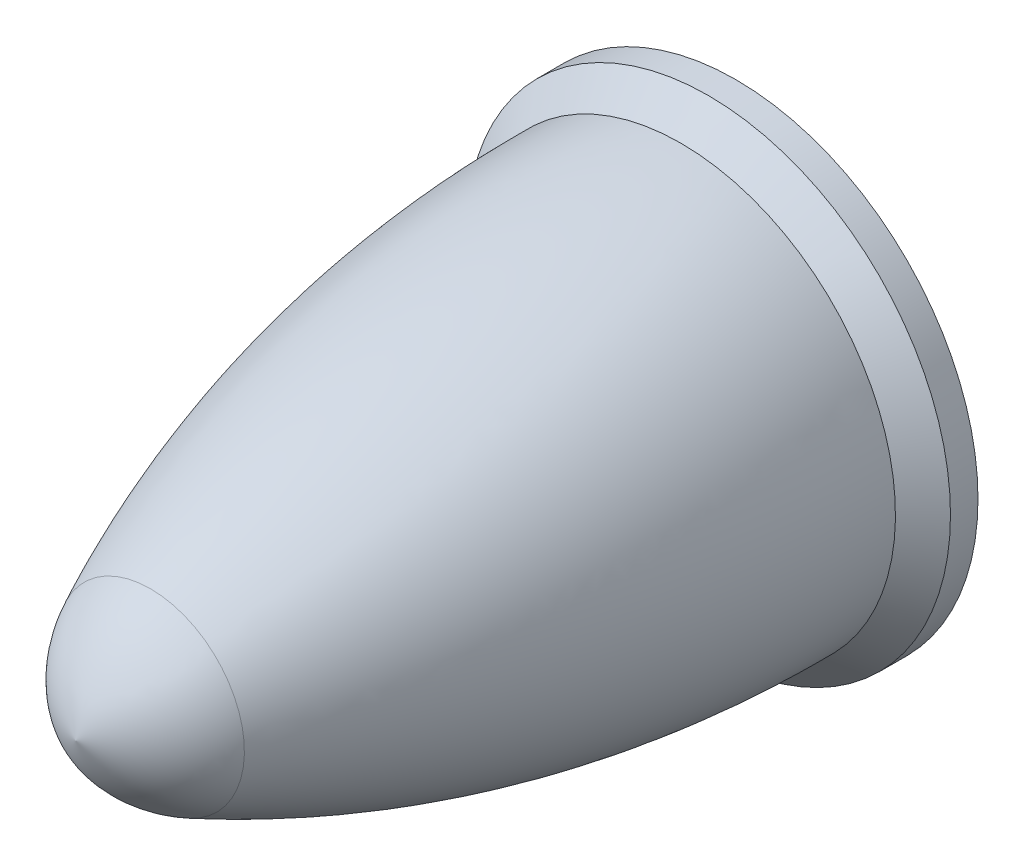
ISO-10303-21;
HEADER;
FILE_DESCRIPTION(('STEP AP214'),'2;1');
FILE_NAME('part.step','',(''),(''),'','','');
FILE_SCHEMA(('AUTOMOTIVE_DESIGN { 1 0 10303 214 1 1 1 1 }'));
ENDSEC;
DATA;
#1=APPLICATION_CONTEXT('core data for automotive mechanical design processes');
#2=APPLICATION_PROTOCOL_DEFINITION('international standard','automotive_design',2000,#1);
#3=PRODUCT_CONTEXT('',#1,'mechanical');
#4=PRODUCT('Part','Part','',(#3));
#5=PRODUCT_RELATED_PRODUCT_CATEGORY('part','',(#4));
#6=PRODUCT_DEFINITION_FORMATION('','',#4);
#7=PRODUCT_DEFINITION_CONTEXT('part definition',#1,'design');
#8=PRODUCT_DEFINITION('design','',#6,#7);
#9=PRODUCT_DEFINITION_SHAPE('','',#8);
#10=(LENGTH_UNIT() NAMED_UNIT(*) SI_UNIT(.MILLI.,.METRE.));
#11=(NAMED_UNIT(*) PLANE_ANGLE_UNIT() SI_UNIT($,.RADIAN.));
#12=(NAMED_UNIT(*) SI_UNIT($,.STERADIAN.) SOLID_ANGLE_UNIT());
#13=UNCERTAINTY_MEASURE_WITH_UNIT(LENGTH_MEASURE(1.E-05),#10,'distance_accuracy_value','');
#14=(GEOMETRIC_REPRESENTATION_CONTEXT(3) GLOBAL_UNCERTAINTY_ASSIGNED_CONTEXT((#13)) GLOBAL_UNIT_ASSIGNED_CONTEXT((#10,
#11,#12)) REPRESENTATION_CONTEXT('',''));
#15=CARTESIAN_POINT('',(0.,0.,0.));
#16=DIRECTION('',(0.,0.,1.));
#17=DIRECTION('',(1.,0.,0.));
#18=AXIS2_PLACEMENT_3D('',#15,#16,#17);
#19=CARTESIAN_POINT('',(0.,-3.,21.9999999999914));
#20=DIRECTION('',(0.,0.,-1.));
#21=DIRECTION('',(-1.,0.,0.));
#22=AXIS2_PLACEMENT_3D('',#19,#20,#21);
#23=CONICAL_SURFACE('',#22,2.50000000001182,1.02974425866684);
#24=CARTESIAN_POINT('',(0.,-2.99999999994316,23.5021515475466));
#25=VERTEX_POINT('',#24);
#26=VERTEX_LOOP('',#25);
#27=FACE_BOUND('',#26,.T.);
#28=CARTESIAN_POINT('',(0.,-3.,22.));
#29=DIRECTION('',(0.,0.,-1.));
#30=DIRECTION('',(0.,1.,0.));
#31=AXIS2_PLACEMENT_3D('',#28,#29,#30);
#32=CIRCLE('',#31,2.49999999999999);
#33=CARTESIAN_POINT('',(0.,-0.500000000000013,22.));
#34=VERTEX_POINT('',#33);
#35=EDGE_CURVE('E36',#34,#34,#32,.T.);
#36=ORIENTED_EDGE('',*,*,#35,.T.);
#37=EDGE_LOOP('',(#36));
#38=FACE_BOUND('',#37,.T.);
#39=ADVANCED_FACE('F16',(#27,#38),#23,.F.);
#40=CARTESIAN_POINT('',(0.,-3.,0.));
#41=DIRECTION('',(0.,0.,-1.));
#42=DIRECTION('',(0.,1.,0.));
#43=AXIS2_PLACEMENT_3D('',#40,#41,#42);
#44=CYLINDRICAL_SURFACE('',#43,2.49999999999999);
#45=CARTESIAN_POINT('',(0.,-3.,0.));
#46=DIRECTION('',(0.,0.,-1.));
#47=DIRECTION('',(0.,1.,0.));
#48=AXIS2_PLACEMENT_3D('',#45,#46,#47);
#49=CIRCLE('',#48,2.49999999999999);
#50=CARTESIAN_POINT('',(0.,-0.500000000000011,0.));
#51=VERTEX_POINT('',#50);
#52=EDGE_CURVE('E19',#51,#51,#49,.F.);
#53=ORIENTED_EDGE('',*,*,#52,.F.);
#54=EDGE_LOOP('',(#53));
#55=FACE_BOUND('',#54,.T.);
#56=ORIENTED_EDGE('',*,*,#35,.F.);
#57=EDGE_LOOP('',(#56));
#58=FACE_BOUND('',#57,.T.);
#59=ADVANCED_FACE('F33',(#55,#58),#44,.F.);
#60=CARTESIAN_POINT('',(0.,-3.,0.));
#61=DIRECTION('',(0.,0.,-1.));
#62=DIRECTION('',(0.,1.,0.));
#63=AXIS2_PLACEMENT_3D('',#60,#61,#62);
#64=PLANE('',#63);
#65=CARTESIAN_POINT('',(0.,-3.,0.));
#66=DIRECTION('',(0.,0.,-1.));
#67=DIRECTION('',(0.,1.,0.));
#68=AXIS2_PLACEMENT_3D('',#65,#66,#67);
#69=CIRCLE('',#68,8.80000000069722);
#70=CARTESIAN_POINT('',(0.,5.80000000069722,0.));
#71=VERTEX_POINT('',#70);
#72=EDGE_CURVE('E40',#71,#71,#69,.F.);
#73=ORIENTED_EDGE('',*,*,#72,.F.);
#74=EDGE_LOOP('',(#73));
#75=FACE_BOUND('',#74,.T.);
#76=ORIENTED_EDGE('',*,*,#52,.T.);
#77=EDGE_LOOP('',(#76));
#78=FACE_BOUND('',#77,.T.);
#79=ADVANCED_FACE('F66',(#75,#78),#64,.T.);
#80=CARTESIAN_POINT('',(0.,-3.,0.));
#81=DIRECTION('',(0.,0.,-1.));
#82=DIRECTION('',(0.,1.,0.));
#83=AXIS2_PLACEMENT_3D('',#80,#81,#82);
#84=CYLINDRICAL_SURFACE('',#83,8.80000000069722);
#85=ORIENTED_EDGE('',*,*,#72,.T.);
#86=EDGE_LOOP('',(#85));
#87=FACE_BOUND('',#86,.T.);
#88=CARTESIAN_POINT('',(0.,-3.,1.00000000015868));
#89=DIRECTION('',(0.,0.,-1.));
#90=DIRECTION('',(0.,1.,0.));
#91=AXIS2_PLACEMENT_3D('',#88,#89,#90);
#92=CIRCLE('',#91,8.80000000069722);
#93=CARTESIAN_POINT('',(0.,5.80000000069722,1.00000000015868));
#94=VERTEX_POINT('',#93);
#95=EDGE_CURVE('E42',#94,#94,#92,.F.);
#96=ORIENTED_EDGE('',*,*,#95,.F.);
#97=EDGE_LOOP('',(#96));
#98=FACE_BOUND('',#97,.T.);
#99=ADVANCED_FACE('F62',(#87,#98),#84,.T.);
#100=CARTESIAN_POINT('',(0.,-4.1790602896945,19.0224405675289));
#101=DIRECTION('',(1.,0.,0.));
#102=DIRECTION('',(0.,1.,0.));
#103=AXIS2_PLACEMENT_3D('',#100,#101,#102);
#104=CIRCLE('',#103,5.11529872739771);
#105=TRIMMED_CURVE('',#104,(PARAMETER_VALUE(-1.33820806663948)),
(PARAMETER_VALUE(1.33820806663948)),.T.,.PARAMETER.);
#106=CARTESIAN_POINT('',(0.,-3.,19.0224405675289));
#107=DIRECTION('',(0.,0.,-1.));
#108=AXIS1_PLACEMENT('',#106,#107);
#109=SURFACE_OF_REVOLUTION('',#105,#108);
#110=CARTESIAN_POINT('',(0.,-3.,24.));
#111=VERTEX_POINT('',#110);
#112=VERTEX_LOOP('',#111);
#113=FACE_BOUND('',#112,.T.);
#114=CARTESIAN_POINT('',(0.,-3.,21.2767175898783));
#115=DIRECTION('',(0.,0.,-1.));
#116=DIRECTION('',(0.,1.,0.));
#117=AXIS2_PLACEMENT_3D('',#114,#115,#116);
#118=CIRCLE('',#117,3.41272761666876);
#119=CARTESIAN_POINT('',(0.,0.412727616668766,21.2767175898783));
#120=VERTEX_POINT('',#119);
#121=EDGE_CURVE('E25',#120,#120,#118,.T.);
#122=ORIENTED_EDGE('',*,*,#121,.F.);
#123=EDGE_LOOP('',(#122));
#124=FACE_BOUND('',#123,.T.);
#125=ADVANCED_FACE('F57',(#113,#124),#109,.F.);
#126=CARTESIAN_POINT('',(0.,-3.,1.00000000015868));
#127=DIRECTION('',(0.,0.,-1.));
#128=DIRECTION('',(0.,1.,0.));
#129=AXIS2_PLACEMENT_3D('',#126,#127,#128);
#130=CONICAL_SURFACE('',#129,8.80000000069722,0.785398163397406);
#131=ORIENTED_EDGE('',*,*,#95,.T.);
#132=EDGE_LOOP('',(#131));
#133=FACE_BOUND('',#132,.T.);
#134=CARTESIAN_POINT('',(0.,-3.,2.00000000015925));
#135=DIRECTION('',(0.,0.,-1.));
#136=DIRECTION('',(0.,1.,0.));
#137=AXIS2_PLACEMENT_3D('',#134,#135,#136);
#138=CIRCLE('',#137,7.80000000069675);
#139=CARTESIAN_POINT('',(0.,4.80000000069675,2.00000000015925));
#140=VERTEX_POINT('',#139);
#141=EDGE_CURVE('E11',#140,#140,#138,.F.);
#142=ORIENTED_EDGE('',*,*,#141,.F.);
#143=EDGE_LOOP('',(#142));
#144=FACE_BOUND('',#143,.T.);
#145=ADVANCED_FACE('F61',(#133,#144),#130,.T.);
#146=CARTESIAN_POINT('',(0.,-38.0832465119294,2.37763259276898));
#147=DIRECTION('',(1.,0.,0.));
#148=DIRECTION('',(0.,1.,0.));
#149=AXIS2_PLACEMENT_3D('',#146,#147,#148);
#150=CIRCLE('',#149,42.8849092086909);
#151=TRIMMED_CURVE('',#150,(PARAMETER_VALUE(-0.61273342597087)),
(PARAMETER_VALUE(0.612733425970869)),.T.,.PARAMETER.);
#152=CARTESIAN_POINT('',(0.,-3.,2.37763259276898));
#153=DIRECTION('',(0.,0.,-1.));
#154=AXIS1_PLACEMENT('',#152,#153);
#155=SURFACE_OF_REVOLUTION('',#151,#154);
#156=ORIENTED_EDGE('',*,*,#121,.T.);
#157=EDGE_LOOP('',(#156));
#158=FACE_BOUND('',#157,.T.);
#159=ORIENTED_EDGE('',*,*,#141,.T.);
#160=EDGE_LOOP('',(#159));
#161=FACE_BOUND('',#160,.T.);
#162=ADVANCED_FACE('F75',(#158,#161),#155,.F.);
#163=CLOSED_SHELL('',(#39,#59,#79,#99,#125,#145,#162));
#164=MANIFOLD_SOLID_BREP('B1',#163);
#165=ADVANCED_BREP_SHAPE_REPRESENTATION('',(#18,#164),#14);
#166=SHAPE_DEFINITION_REPRESENTATION(#9,#165);
ENDSEC;
END-ISO-10303-21;
